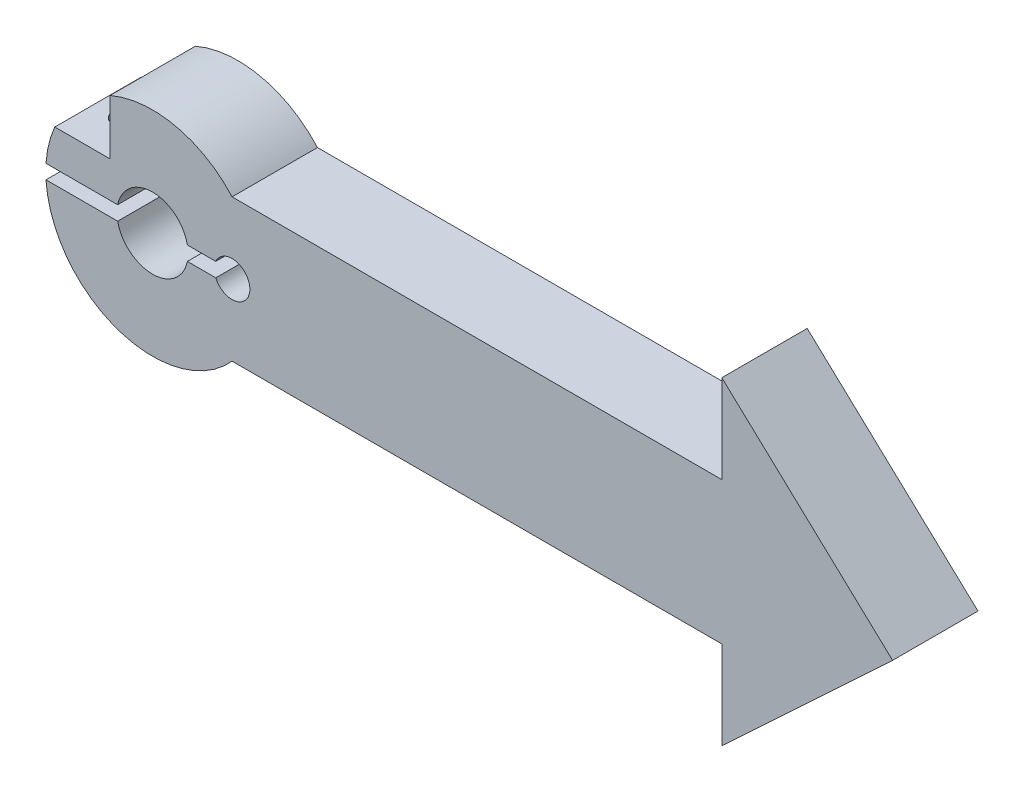
ISO-10303-21;
HEADER;
FILE_DESCRIPTION(('STEP AP214'),'2;1');
FILE_NAME('part.step','',(''),(''),'','','');
FILE_SCHEMA(('AUTOMOTIVE_DESIGN { 1 0 10303 214 1 1 1 1 }'));
ENDSEC;
DATA;
#1=APPLICATION_CONTEXT('core data for automotive mechanical design processes');
#2=APPLICATION_PROTOCOL_DEFINITION('international standard','automotive_design',2000,#1);
#3=PRODUCT_CONTEXT('',#1,'mechanical');
#4=PRODUCT('Part','Part','',(#3));
#5=PRODUCT_RELATED_PRODUCT_CATEGORY('part','',(#4));
#6=PRODUCT_DEFINITION_FORMATION('','',#4);
#7=PRODUCT_DEFINITION_CONTEXT('part definition',#1,'design');
#8=PRODUCT_DEFINITION('design','',#6,#7);
#9=PRODUCT_DEFINITION_SHAPE('','',#8);
#10=(LENGTH_UNIT() NAMED_UNIT(*) SI_UNIT(.MILLI.,.METRE.));
#11=(NAMED_UNIT(*) PLANE_ANGLE_UNIT() SI_UNIT($,.RADIAN.));
#12=(NAMED_UNIT(*) SI_UNIT($,.STERADIAN.) SOLID_ANGLE_UNIT());
#13=UNCERTAINTY_MEASURE_WITH_UNIT(LENGTH_MEASURE(1.E-05),#10,'distance_accuracy_value','');
#14=(GEOMETRIC_REPRESENTATION_CONTEXT(3) GLOBAL_UNCERTAINTY_ASSIGNED_CONTEXT((#13)) GLOBAL_UNIT_ASSIGNED_CONTEXT((#10,
#11,#12)) REPRESENTATION_CONTEXT('',''));
#15=CARTESIAN_POINT('',(0.,0.,0.));
#16=DIRECTION('',(0.,0.,1.));
#17=DIRECTION('',(1.,0.,0.));
#18=AXIS2_PLACEMENT_3D('',#15,#16,#17);
#19=CARTESIAN_POINT('',(0.,0.,15.24));
#20=DIRECTION('',(0.,0.,-1.));
#21=DIRECTION('',(-1.,0.,0.));
#22=AXIS2_PLACEMENT_3D('',#19,#20,#21);
#23=CYLINDRICAL_SURFACE('',#22,19.05);
#24=CARTESIAN_POINT('',(0.,0.,0.));
#25=DIRECTION('',(0.,0.,1.));
#26=DIRECTION('',(1.,0.,0.));
#27=AXIS2_PLACEMENT_3D('',#24,#25,#26);
#28=CIRCLE('',#27,19.05);
#29=CARTESIAN_POINT('',(14.1990316571237,12.7,0.));
#30=VERTEX_POINT('',#29);
#31=CARTESIAN_POINT('',(-7.58638208892457,17.4742469594785,0.));
#32=VERTEX_POINT('',#31);
#33=EDGE_CURVE('E206',#30,#32,#28,.T.);
#34=ORIENTED_EDGE('',*,*,#33,.T.);
#35=DIRECTION('',(0.,0.,-1.));
#36=VECTOR('',#35,1.);
#37=CARTESIAN_POINT('',(-7.58638208892456,17.4742469594785,15.24));
#38=LINE('',#37,#36);
#39=CARTESIAN_POINT('',(-7.58638208892457,17.4742469594785,15.24));
#40=VERTEX_POINT('',#39);
#41=EDGE_CURVE('E252',#32,#40,#38,.F.);
#42=ORIENTED_EDGE('',*,*,#41,.T.);
#43=CARTESIAN_POINT('',(0.,0.,15.24));
#44=DIRECTION('',(0.,0.,1.));
#45=DIRECTION('',(1.,0.,0.));
#46=AXIS2_PLACEMENT_3D('',#43,#44,#45);
#47=CIRCLE('',#46,19.05);
#48=CARTESIAN_POINT('',(14.1990316571237,12.7,15.24));
#49=VERTEX_POINT('',#48);
#50=EDGE_CURVE('E377',#49,#40,#47,.T.);
#51=ORIENTED_EDGE('',*,*,#50,.F.);
#52=DIRECTION('',(0.,0.,-1.));
#53=VECTOR('',#52,1.);
#54=CARTESIAN_POINT('',(14.1990316571237,12.7,15.24));
#55=LINE('',#54,#53);
#56=EDGE_CURVE('E227',#49,#30,#55,.T.);
#57=ORIENTED_EDGE('',*,*,#56,.T.);
#58=EDGE_LOOP('',(#34,#42,#51,#57));
#59=FACE_BOUND('',#58,.T.);
#60=ADVANCED_FACE('F32',(#59),#23,.T.);
#61=CARTESIAN_POINT('',(0.,0.,15.24));
#62=DIRECTION('',(0.,0.,-1.));
#63=DIRECTION('',(-1.,0.,0.));
#64=AXIS2_PLACEMENT_3D('',#61,#62,#63);
#65=CYLINDRICAL_SURFACE('',#64,6.35);
#66=CARTESIAN_POINT('',(0.,0.,0.));
#67=DIRECTION('',(0.,0.,-1.));
#68=DIRECTION('',(1.,0.,0.));
#69=AXIS2_PLACEMENT_3D('',#66,#67,#68);
#70=CIRCLE('',#69,6.35);
#71=CARTESIAN_POINT('',(6.22170394666927,-1.27,0.));
#72=VERTEX_POINT('',#71);
#73=CARTESIAN_POINT('',(-6.22170394666927,-1.27,0.));
#74=VERTEX_POINT('',#73);
#75=EDGE_CURVE('E185',#72,#74,#70,.T.);
#76=ORIENTED_EDGE('',*,*,#75,.T.);
#77=DIRECTION('',(0.,0.,-1.));
#78=VECTOR('',#77,1.);
#79=CARTESIAN_POINT('',(-6.22170394666927,-1.27,15.24));
#80=LINE('',#79,#78);
#81=CARTESIAN_POINT('',(-6.22170394666927,-1.27,15.24));
#82=VERTEX_POINT('',#81);
#83=EDGE_CURVE('E11',#82,#74,#80,.T.);
#84=ORIENTED_EDGE('',*,*,#83,.F.);
#85=CARTESIAN_POINT('',(0.,0.,15.24));
#86=DIRECTION('',(0.,0.,-1.));
#87=DIRECTION('',(1.,0.,0.));
#88=AXIS2_PLACEMENT_3D('',#85,#86,#87);
#89=CIRCLE('',#88,6.35);
#90=CARTESIAN_POINT('',(6.22170394666927,-1.27,15.24));
#91=VERTEX_POINT('',#90);
#92=EDGE_CURVE('E217',#91,#82,#89,.T.);
#93=ORIENTED_EDGE('',*,*,#92,.F.);
#94=DIRECTION('',(0.,0.,-1.));
#95=VECTOR('',#94,1.);
#96=CARTESIAN_POINT('',(6.22170394666927,-1.27,15.24));
#97=LINE('',#96,#95);
#98=EDGE_CURVE('E181',#91,#72,#97,.T.);
#99=ORIENTED_EDGE('',*,*,#98,.T.);
#100=EDGE_LOOP('',(#76,#84,#93,#99));
#101=FACE_BOUND('',#100,.T.);
#102=ADVANCED_FACE('F34',(#101),#65,.F.);
#103=CARTESIAN_POINT('',(-6.22170394666927,-1.27,15.24));
#104=DIRECTION('',(0.,-1.,0.));
#105=DIRECTION('',(0.,0.,-1.));
#106=AXIS2_PLACEMENT_3D('',#103,#104,#105);
#107=PLANE('',#106);
#108=CARTESIAN_POINT('',(-12.6146617357404,-1.27,7.62));
#109=DIRECTION('',(0.,-1.,0.));
#110=DIRECTION('',(0.,0.,-1.));
#111=AXIS2_PLACEMENT_3D('',#108,#109,#110);
#112=CIRCLE('',#111,2.032);
#113=CARTESIAN_POINT('',(-12.6146617357404,-1.27,5.588));
#114=VERTEX_POINT('',#113);
#115=EDGE_CURVE('E189',#114,#114,#112,.T.);
#116=ORIENTED_EDGE('',*,*,#115,.T.);
#117=EDGE_LOOP('',(#116));
#118=FACE_BOUND('',#117,.T.);
#119=DIRECTION('',(-1.,0.,0.));
#120=VECTOR('',#119,1.);
#121=CARTESIAN_POINT('',(-6.22170394666927,-1.27,0.));
#122=LINE('',#121,#120);
#123=CARTESIAN_POINT('',(-19.0076195248116,-1.27,0.));
#124=VERTEX_POINT('',#123);
#125=EDGE_CURVE('E188',#74,#124,#122,.T.);
#126=ORIENTED_EDGE('',*,*,#125,.T.);
#127=DIRECTION('',(0.,0.,-1.));
#128=VECTOR('',#127,1.);
#129=CARTESIAN_POINT('',(-19.0076195248116,-1.27,15.24));
#130=LINE('',#129,#128);
#131=CARTESIAN_POINT('',(-19.0076195248116,-1.27,15.24));
#132=VERTEX_POINT('',#131);
#133=EDGE_CURVE('E41',#132,#124,#130,.T.);
#134=ORIENTED_EDGE('',*,*,#133,.F.);
#135=DIRECTION('',(-1.,0.,0.));
#136=VECTOR('',#135,1.);
#137=CARTESIAN_POINT('',(-6.22170394666927,-1.27,15.24));
#138=LINE('',#137,#136);
#139=EDGE_CURVE('E120',#82,#132,#138,.T.);
#140=ORIENTED_EDGE('',*,*,#139,.F.);
#141=ORIENTED_EDGE('',*,*,#83,.T.);
#142=EDGE_LOOP('',(#126,#134,#140,#141));
#143=FACE_BOUND('',#142,.T.);
#144=ADVANCED_FACE('F334',(#118,#143),#107,.F.);
#145=CARTESIAN_POINT('',(0.,0.,15.24));
#146=DIRECTION('',(0.,0.,-1.));
#147=DIRECTION('',(-1.,0.,0.));
#148=AXIS2_PLACEMENT_3D('',#145,#146,#147);
#149=CYLINDRICAL_SURFACE('',#148,19.05);
#150=CARTESIAN_POINT('',(-12.6146617357404,-14.2749013759411,9.652));
#151=CARTESIAN_POINT('',(-12.4857866337776,-14.3887850958957,9.65200210380402));
#152=CARTESIAN_POINT('',(-12.3552776209016,-14.5009871859667,9.63976482709046));
#153=CARTESIAN_POINT('',(-12.094193933316,-14.7194395852111,9.58870944171503));
#154=CARTESIAN_POINT('',(-11.9636192509278,-14.8256879889063,9.54988287512061));
#155=CARTESIAN_POINT('',(-11.7307541687428,-15.010322956646,9.45318472630357));
#156=CARTESIAN_POINT('',(-11.6276828719724,-15.0902374321598,9.40013644598671));
#157=CARTESIAN_POINT('',(-11.4281486968179,-15.2419011479792,9.27381594972289));
#158=CARTESIAN_POINT('',(-11.3316764787594,-15.3136620273848,9.20057308661684));
#159=CARTESIAN_POINT('',(-11.1653640715659,-15.4352163369413,9.047943752071));
#160=CARTESIAN_POINT('',(-11.093794859303,-15.4866661642724,8.97176951989969));
#161=CARTESIAN_POINT('',(-10.9611982688009,-15.5807971715087,8.80589138700722));
#162=CARTESIAN_POINT('',(-10.9001687343882,-15.6234801452477,8.71619026062499));
#163=CARTESIAN_POINT('',(-10.7915179288074,-15.6987281148808,8.52411529702373));
#164=CARTESIAN_POINT('',(-10.7439954337551,-15.7312187451476,8.42165560553872));
#165=CARTESIAN_POINT('',(-10.666116486945,-15.7841284286655,8.20748772068497));
#166=CARTESIAN_POINT('',(-10.6357464197927,-15.8045570571779,8.09578694376513));
#167=CARTESIAN_POINT('',(-10.5970611790767,-15.8305167254227,7.88189238998532));
#168=CARTESIAN_POINT('',(-10.5864269985712,-15.8376155964626,7.78030325012898));
#169=CARTESIAN_POINT('',(-10.5805754221841,-15.8415259416978,7.57650297422804));
#170=CARTESIAN_POINT('',(-10.5853511263629,-15.8383420201222,7.4742921370121));
#171=CARTESIAN_POINT('',(-10.6092041874284,-15.8223722499117,7.2791042138714));
#172=CARTESIAN_POINT('',(-10.627339116418,-15.8102190407314,7.18595680095776));
#173=CARTESIAN_POINT('',(-10.6758526624204,-15.7775004094257,7.00447855964649));
#174=CARTESIAN_POINT('',(-10.7062315664809,-15.7569347900798,6.91614784422657));
#175=CARTESIAN_POINT('',(-10.7789351394036,-15.7072927200223,6.74353724077259));
#176=CARTESIAN_POINT('',(-10.8216148242822,-15.6779622053325,6.65948119217993));
#177=CARTESIAN_POINT('',(-10.9165605816147,-15.6119999235519,6.5001387484275));
#178=CARTESIAN_POINT('',(-10.9688299568002,-15.5753656406332,6.42485538927203));
#179=CARTESIAN_POINT('',(-11.0872312375785,-15.4913403235635,6.27612854651979));
#180=CARTESIAN_POINT('',(-11.1542584282695,-15.4432060145903,6.2038214464821));
#181=CARTESIAN_POINT('',(-11.2951900705916,-15.3404302571313,6.07165647533613));
#182=CARTESIAN_POINT('',(-11.3690980538144,-15.285785463046,6.01180504870107));
#183=CARTESIAN_POINT('',(-11.534727644024,-15.1613002437101,5.89526641352199));
#184=CARTESIAN_POINT('',(-11.6273261200758,-15.0904630563288,5.84089590568113));
#185=CARTESIAN_POINT('',(-11.8160770446297,-14.9431322680368,5.74854459211678));
#186=CARTESIAN_POINT('',(-11.9122316578885,-14.8666351924171,5.71057395402104));
#187=CARTESIAN_POINT('',(-12.1262716663098,-14.6928138564442,5.64374741298494));
#188=CARTESIAN_POINT('',(-12.2444718352153,-14.5944944234861,5.61849120540177));
#189=CARTESIAN_POINT('',(-12.4799213290006,-14.3936821795389,5.58899823514503));
#190=CARTESIAN_POINT('',(-12.5971699041568,-14.291186400879,5.58477669167939));
#191=CARTESIAN_POINT('',(-12.8525895936386,-14.0623099545596,5.59713471140405));
#192=CARTESIAN_POINT('',(-12.9900604889909,-13.9353817938513,5.6182068650858));
#193=CARTESIAN_POINT('',(-13.257701239533,-13.6810083450583,5.68747241000493));
#194=CARTESIAN_POINT('',(-13.3878641997814,-13.5535626863436,5.73569095586356));
#195=CARTESIAN_POINT('',(-13.6293047063801,-13.3105906511668,5.85467915550316));
#196=CARTESIAN_POINT('',(-13.7412665037081,-13.1948550542427,5.92363077410582));
#197=CARTESIAN_POINT('',(-13.9537034905758,-12.9699808442794,6.08578363440979));
#198=CARTESIAN_POINT('',(-14.0541993348723,-12.8608305412119,6.17894024800866));
#199=CARTESIAN_POINT('',(-14.2068292001517,-12.6915966596066,6.35415464444172));
#200=CARTESIAN_POINT('',(-14.2635429174207,-12.6277556129232,6.42859664589097));
#201=CARTESIAN_POINT('',(-14.368429663214,-12.5082772141964,6.58922534547687));
#202=CARTESIAN_POINT('',(-14.4166157465653,-12.4526273447735,6.67539372774858));
#203=CARTESIAN_POINT('',(-14.4919966887916,-12.3647523428383,6.83849227689228));
#204=CARTESIAN_POINT('',(-14.5214720627197,-12.3300804105877,6.91303211629368));
#205=CARTESIAN_POINT('',(-14.5721002999088,-12.2702050997158,7.06852577629297));
#206=CARTESIAN_POINT('',(-14.5932602650639,-12.2449936420746,7.14947405236146));
#207=CARTESIAN_POINT('',(-14.6257668489635,-12.2061506048723,7.31698780951715));
#208=CARTESIAN_POINT('',(-14.6370129788226,-12.1926376278756,7.40360146129383));
#209=CARTESIAN_POINT('',(-14.6481244629038,-12.1792873062417,7.57858256949437));
#210=CARTESIAN_POINT('',(-14.6479998111842,-12.1794379523109,7.66694841756277));
#211=CARTESIAN_POINT('',(-14.6373002197981,-12.1922918101075,7.82861913883028));
#212=CARTESIAN_POINT('',(-14.6282966177865,-12.2031075585072,7.90219384538767));
#213=CARTESIAN_POINT('',(-14.6028227009706,-12.2335792744494,8.04613235248065));
#214=CARTESIAN_POINT('',(-14.5863485174824,-12.2532398222806,8.11649446855166));
#215=CARTESIAN_POINT('',(-14.5404032105313,-12.3077541955342,8.27533032074476));
#216=CARTESIAN_POINT('',(-14.5084348595916,-12.3454831419063,8.36208776524481));
#217=CARTESIAN_POINT('',(-14.4354814724072,-12.4307092090796,8.52651649944146));
#218=CARTESIAN_POINT('',(-14.3944785373287,-12.4782257081043,8.6041692768701));
#219=CARTESIAN_POINT('',(-14.285597085439,-12.6029251837568,8.78289108522686));
#220=CARTESIAN_POINT('',(-14.2138872452639,-12.6838888681715,8.87896189508282));
#221=CARTESIAN_POINT('',(-14.0597971155596,-12.8544895649268,9.05324220528134));
#222=CARTESIAN_POINT('',(-13.9773918915456,-12.944146717052,9.13140874904422));
#223=CARTESIAN_POINT('',(-13.8313469662709,-13.0997692251502,9.24927878931659));
#224=CARTESIAN_POINT('',(-13.769823221623,-13.1644490453298,9.29338964539716));
#225=CARTESIAN_POINT('',(-13.6434629549172,-13.2953646544015,9.373912924758));
#226=CARTESIAN_POINT('',(-13.5786250361758,-13.3616010928358,9.41032206855482));
#227=CARTESIAN_POINT('',(-13.3800248309874,-13.5614331589044,9.50812232603346));
#228=CARTESIAN_POINT('',(-13.2419116611864,-13.696435021516,9.55829476417236));
#229=CARTESIAN_POINT('',(-13.0211086509943,-13.9055787614455,9.61258576714312));
#230=CARTESIAN_POINT('',(-12.9411147419666,-13.9800612847555,9.62726310361051));
#231=CARTESIAN_POINT('',(-12.779191497686,-14.1282265844785,9.64696940385761));
#232=CARTESIAN_POINT('',(-12.6972622194667,-14.2019093843654,9.65199865159968));
#233=CARTESIAN_POINT('',(-12.6146617357404,-14.2749013759411,9.652));
#234=B_SPLINE_CURVE_WITH_KNOTS('',3,(#150,#151,#152,#153,#154,#155,#156,#157,#158,#159,#160,
#161,#162,#163,#164,#165,#166,#167,#168,#169,#170,#171,#172,#173,#174,#175,#176,#177,#178,#179,
#180,#181,#182,#183,#184,#185,#186,#187,#188,#189,#190,#191,#192,#193,#194,#195,#196,#197,#198,
#199,#200,#201,#202,#203,#204,#205,#206,#207,#208,#209,#210,#211,#212,#213,#214,#215,#216,#217,
#218,#219,#220,#221,#222,#223,#224,#225,#226,#227,#228,#229,#230,#231,#232,#233),.UNSPECIFIED.,
.T.,.F.,(4,2,2,2,2,2,2,2,2,2,2,2,2,2,2,2,2,2,2,2,2,2,2,2,2,2,2,2,2,2,2,2,2,2,2,2,2,2,2,2,2,4),
(0.,0.515629978535745,1.0314240528624,1.45224229090547,1.87245206479683,2.22053710863591,
2.56855085778306,2.91904771555553,3.26926596062076,3.57481396734687,3.88022518069565,
4.16593525849906,4.45165203487627,4.74662213447884,5.04169401443996,5.36959181890863,
5.69765885579402,6.08217842520451,6.4669360488995,6.93266300254468,7.39872687467388,
7.96138734164273,8.52457004602681,9.04826872231599,9.57100859443025,9.90993515052782,
10.248338274157,10.5093914252942,10.7702211331528,11.0336652383987,11.2968777984024,
11.520583633147,11.7444054477854,12.0423303158302,12.3408508102759,12.7724820783073,
13.2051383308717,13.5034822805029,13.8019530140485,14.3975892283701,14.7280839368451,
15.0585689180565),.UNSPECIFIED.);
#235=CARTESIAN_POINT('',(-12.6146617357404,-14.2749013759411,9.652));
#236=VERTEX_POINT('',#235);
#237=EDGE_CURVE('E251',#236,#236,#234,.T.);
#238=ORIENTED_EDGE('',*,*,#237,.T.);
#239=EDGE_LOOP('',(#238));
#240=FACE_BOUND('',#239,.T.);
#241=CARTESIAN_POINT('',(0.,0.,0.));
#242=DIRECTION('',(0.,0.,1.));
#243=DIRECTION('',(1.,0.,0.));
#244=AXIS2_PLACEMENT_3D('',#241,#242,#243);
#245=CIRCLE('',#244,19.05);
#246=CARTESIAN_POINT('',(14.1990316571237,-12.7,0.));
#247=VERTEX_POINT('',#246);
#248=EDGE_CURVE('E191',#124,#247,#245,.T.);
#249=ORIENTED_EDGE('',*,*,#248,.T.);
#250=DIRECTION('',(0.,0.,-1.));
#251=VECTOR('',#250,1.);
#252=CARTESIAN_POINT('',(14.1990316571237,-12.7,15.24));
#253=LINE('',#252,#251);
#254=CARTESIAN_POINT('',(14.1990316571237,-12.7,15.24));
#255=VERTEX_POINT('',#254);
#256=EDGE_CURVE('E245',#255,#247,#253,.T.);
#257=ORIENTED_EDGE('',*,*,#256,.F.);
#258=CARTESIAN_POINT('',(0.,0.,15.24));
#259=DIRECTION('',(0.,0.,1.));
#260=DIRECTION('',(1.,0.,0.));
#261=AXIS2_PLACEMENT_3D('',#258,#259,#260);
#262=CIRCLE('',#261,19.05);
#263=EDGE_CURVE('E392',#132,#255,#262,.T.);
#264=ORIENTED_EDGE('',*,*,#263,.F.);
#265=ORIENTED_EDGE('',*,*,#133,.T.);
#266=EDGE_LOOP('',(#249,#257,#264,#265));
#267=FACE_BOUND('',#266,.T.);
#268=ADVANCED_FACE('F273',(#240,#267),#149,.T.);
#269=CARTESIAN_POINT('',(14.1990316571237,-12.7,15.24));
#270=DIRECTION('',(0.,1.,0.));
#271=DIRECTION('',(0.,0.,1.));
#272=AXIS2_PLACEMENT_3D('',#269,#270,#271);
#273=PLANE('',#272);
#274=DIRECTION('',(1.,0.,0.));
#275=VECTOR('',#274,1.);
#276=CARTESIAN_POINT('',(14.1990316571237,-12.7,0.));
#277=LINE('',#276,#275);
#278=CARTESIAN_POINT('',(101.6,-12.7,0.));
#279=VERTEX_POINT('',#278);
#280=EDGE_CURVE('E193',#247,#279,#277,.T.);
#281=ORIENTED_EDGE('',*,*,#280,.T.);
#282=DIRECTION('',(0.,0.,-1.));
#283=VECTOR('',#282,1.);
#284=CARTESIAN_POINT('',(101.6,-12.7,15.24));
#285=LINE('',#284,#283);
#286=CARTESIAN_POINT('',(101.6,-12.7,15.24));
#287=VERTEX_POINT('',#286);
#288=EDGE_CURVE('E242',#287,#279,#285,.T.);
#289=ORIENTED_EDGE('',*,*,#288,.F.);
#290=DIRECTION('',(1.,0.,0.));
#291=VECTOR('',#290,1.);
#292=CARTESIAN_POINT('',(14.1990316571237,-12.7,15.24));
#293=LINE('',#292,#291);
#294=EDGE_CURVE('E396',#255,#287,#293,.T.);
#295=ORIENTED_EDGE('',*,*,#294,.F.);
#296=ORIENTED_EDGE('',*,*,#256,.T.);
#297=EDGE_LOOP('',(#281,#289,#295,#296));
#298=FACE_BOUND('',#297,.T.);
#299=ADVANCED_FACE('F327',(#298),#273,.F.);
#300=CARTESIAN_POINT('',(101.6,-12.7,15.24));
#301=DIRECTION('',(1.,0.,0.));
#302=DIRECTION('',(0.,0.,-1.));
#303=AXIS2_PLACEMENT_3D('',#300,#301,#302);
#304=PLANE('',#303);
#305=DIRECTION('',(0.,-1.,0.));
#306=VECTOR('',#305,1.);
#307=CARTESIAN_POINT('',(101.6,-12.7,0.));
#308=LINE('',#307,#306);
#309=CARTESIAN_POINT('',(101.6,-28.448,0.));
#310=VERTEX_POINT('',#309);
#311=EDGE_CURVE('E195',#279,#310,#308,.T.);
#312=ORIENTED_EDGE('',*,*,#311,.T.);
#313=DIRECTION('',(0.,0.,-1.));
#314=VECTOR('',#313,1.);
#315=CARTESIAN_POINT('',(101.6,-28.448,15.24));
#316=LINE('',#315,#314);
#317=CARTESIAN_POINT('',(101.6,-28.448,15.24));
#318=VERTEX_POINT('',#317);
#319=EDGE_CURVE('E239',#318,#310,#316,.T.);
#320=ORIENTED_EDGE('',*,*,#319,.F.);
#321=DIRECTION('',(0.,-1.,0.));
#322=VECTOR('',#321,1.);
#323=CARTESIAN_POINT('',(101.6,-12.7,15.24));
#324=LINE('',#323,#322);
#325=EDGE_CURVE('E398',#287,#318,#324,.T.);
#326=ORIENTED_EDGE('',*,*,#325,.F.);
#327=ORIENTED_EDGE('',*,*,#288,.T.);
#328=EDGE_LOOP('',(#312,#320,#326,#327));
#329=FACE_BOUND('',#328,.T.);
#330=ADVANCED_FACE('F324',(#329),#304,.F.);
#331=CARTESIAN_POINT('',(101.6,-28.448,15.24));
#332=DIRECTION('',(-0.682318250360011,0.731055268242869,0.));
#333=DIRECTION('',(-0.731055268242869,-0.682318250360011,0.));
#334=AXIS2_PLACEMENT_3D('',#331,#332,#333);
#335=PLANE('',#334);
#336=DIRECTION('',(0.731055268242869,0.682318250360011,0.));
#337=VECTOR('',#336,1.);
#338=CARTESIAN_POINT('',(101.6,-28.448,0.));
#339=LINE('',#338,#337);
#340=CARTESIAN_POINT('',(132.08,0.,0.));
#341=VERTEX_POINT('',#340);
#342=EDGE_CURVE('E197',#310,#341,#339,.T.);
#343=ORIENTED_EDGE('',*,*,#342,.T.);
#344=DIRECTION('',(0.,0.,-1.));
#345=VECTOR('',#344,1.);
#346=CARTESIAN_POINT('',(132.08,0.,15.24));
#347=LINE('',#346,#345);
#348=CARTESIAN_POINT('',(132.08,0.,15.24));
#349=VERTEX_POINT('',#348);
#350=EDGE_CURVE('E236',#349,#341,#347,.T.);
#351=ORIENTED_EDGE('',*,*,#350,.F.);
#352=DIRECTION('',(0.731055268242869,0.682318250360011,0.));
#353=VECTOR('',#352,1.);
#354=CARTESIAN_POINT('',(101.6,-28.448,15.24));
#355=LINE('',#354,#353);
#356=EDGE_CURVE('E400',#318,#349,#355,.T.);
#357=ORIENTED_EDGE('',*,*,#356,.F.);
#358=ORIENTED_EDGE('',*,*,#319,.T.);
#359=EDGE_LOOP('',(#343,#351,#357,#358));
#360=FACE_BOUND('',#359,.T.);
#361=ADVANCED_FACE('F320',(#360),#335,.F.);
#362=CARTESIAN_POINT('',(101.6,28.448,15.24));
#363=DIRECTION('',(-0.682318250360011,-0.731055268242869,0.));
#364=DIRECTION('',(0.731055268242869,-0.682318250360011,0.));
#365=AXIS2_PLACEMENT_3D('',#362,#363,#364);
#366=PLANE('',#365);
#367=DIRECTION('',(-0.731055268242869,0.682318250360011,0.));
#368=VECTOR('',#367,1.);
#369=CARTESIAN_POINT('',(101.6,28.448,0.));
#370=LINE('',#369,#368);
#371=CARTESIAN_POINT('',(101.6,28.448,0.));
#372=VERTEX_POINT('',#371);
#373=EDGE_CURVE('E199',#341,#372,#370,.T.);
#374=ORIENTED_EDGE('',*,*,#373,.T.);
#375=DIRECTION('',(0.,0.,-1.));
#376=VECTOR('',#375,1.);
#377=CARTESIAN_POINT('',(101.6,28.448,15.24));
#378=LINE('',#377,#376);
#379=CARTESIAN_POINT('',(101.6,28.448,15.24));
#380=VERTEX_POINT('',#379);
#381=EDGE_CURVE('E233',#380,#372,#378,.T.);
#382=ORIENTED_EDGE('',*,*,#381,.F.);
#383=DIRECTION('',(-0.731055268242869,0.682318250360011,0.));
#384=VECTOR('',#383,1.);
#385=CARTESIAN_POINT('',(101.6,28.448,15.24));
#386=LINE('',#385,#384);
#387=EDGE_CURVE('E402',#349,#380,#386,.T.);
#388=ORIENTED_EDGE('',*,*,#387,.F.);
#389=ORIENTED_EDGE('',*,*,#350,.T.);
#390=EDGE_LOOP('',(#374,#382,#388,#389));
#391=FACE_BOUND('',#390,.T.);
#392=ADVANCED_FACE('F316',(#391),#366,.F.);
#393=CARTESIAN_POINT('',(101.6,12.7,15.24));
#394=DIRECTION('',(1.,0.,0.));
#395=DIRECTION('',(0.,0.,-1.));
#396=AXIS2_PLACEMENT_3D('',#393,#394,#395);
#397=PLANE('',#396);
#398=DIRECTION('',(0.,-1.,0.));
#399=VECTOR('',#398,1.);
#400=CARTESIAN_POINT('',(101.6,12.7,0.));
#401=LINE('',#400,#399);
#402=CARTESIAN_POINT('',(101.6,12.7,0.));
#403=VERTEX_POINT('',#402);
#404=EDGE_CURVE('E201',#372,#403,#401,.T.);
#405=ORIENTED_EDGE('',*,*,#404,.T.);
#406=DIRECTION('',(0.,0.,-1.));
#407=VECTOR('',#406,1.);
#408=CARTESIAN_POINT('',(101.6,12.7,15.24));
#409=LINE('',#408,#407);
#410=CARTESIAN_POINT('',(101.6,12.7,15.24));
#411=VERTEX_POINT('',#410);
#412=EDGE_CURVE('E230',#411,#403,#409,.T.);
#413=ORIENTED_EDGE('',*,*,#412,.F.);
#414=DIRECTION('',(0.,-1.,0.));
#415=VECTOR('',#414,1.);
#416=CARTESIAN_POINT('',(101.6,12.7,15.24));
#417=LINE('',#416,#415);
#418=EDGE_CURVE('E381',#380,#411,#417,.T.);
#419=ORIENTED_EDGE('',*,*,#418,.F.);
#420=ORIENTED_EDGE('',*,*,#381,.T.);
#421=EDGE_LOOP('',(#405,#413,#419,#420));
#422=FACE_BOUND('',#421,.T.);
#423=ADVANCED_FACE('F312',(#422),#397,.F.);
#424=CARTESIAN_POINT('',(14.1990316571237,12.7,15.24));
#425=DIRECTION('',(0.,-1.,0.));
#426=DIRECTION('',(0.,0.,-1.));
#427=AXIS2_PLACEMENT_3D('',#424,#425,#426);
#428=PLANE('',#427);
#429=DIRECTION('',(-1.,0.,0.));
#430=VECTOR('',#429,1.);
#431=CARTESIAN_POINT('',(14.1990316571237,12.7,0.));
#432=LINE('',#431,#430);
#433=EDGE_CURVE('E203',#403,#30,#432,.T.);
#434=ORIENTED_EDGE('',*,*,#433,.T.);
#435=ORIENTED_EDGE('',*,*,#56,.F.);
#436=DIRECTION('',(-1.,0.,0.));
#437=VECTOR('',#436,1.);
#438=CARTESIAN_POINT('',(14.1990316571237,12.7,15.24));
#439=LINE('',#438,#437);
#440=EDGE_CURVE('E378',#411,#49,#439,.T.);
#441=ORIENTED_EDGE('',*,*,#440,.F.);
#442=ORIENTED_EDGE('',*,*,#412,.T.);
#443=EDGE_LOOP('',(#434,#435,#441,#442));
#444=FACE_BOUND('',#443,.T.);
#445=ADVANCED_FACE('F308',(#444),#428,.F.);
#446=CARTESIAN_POINT('',(-17.4338537044698,7.6787528291477,15.24));
#447=VERTEX_POINT('',#446);
#448=CARTESIAN_POINT('',(-19.0076195248116,1.27,15.24));
#449=VERTEX_POINT('',#448);
#450=EDGE_CURVE('E372',#447,#449,#47,.T.);
#451=ORIENTED_EDGE('',*,*,#450,.F.);
#452=DIRECTION('',(0.,0.,-1.));
#453=VECTOR('',#452,1.);
#454=CARTESIAN_POINT('',(-17.4338537044698,7.6787528291477,15.24));
#455=LINE('',#454,#453);
#456=CARTESIAN_POINT('',(-17.4338537044698,7.6787528291477,0.));
#457=VERTEX_POINT('',#456);
#458=EDGE_CURVE('E258',#447,#457,#455,.T.);
#459=ORIENTED_EDGE('',*,*,#458,.T.);
#460=CARTESIAN_POINT('',(-19.0076195248116,1.27,0.));
#461=VERTEX_POINT('',#460);
#462=EDGE_CURVE('E205',#457,#461,#28,.T.);
#463=ORIENTED_EDGE('',*,*,#462,.T.);
#464=DIRECTION('',(0.,0.,-1.));
#465=VECTOR('',#464,1.);
#466=CARTESIAN_POINT('',(-19.0076195248116,1.27,15.24));
#467=LINE('',#466,#465);
#468=EDGE_CURVE('E224',#449,#461,#467,.T.);
#469=ORIENTED_EDGE('',*,*,#468,.F.);
#470=EDGE_LOOP('',(#451,#459,#463,#469));
#471=FACE_BOUND('',#470,.T.);
#472=ADVANCED_FACE('F305',(#471),#23,.T.);
#473=CARTESIAN_POINT('',(-19.0076195248116,1.27,15.24));
#474=DIRECTION('',(0.,1.,0.));
#475=DIRECTION('',(0.,0.,1.));
#476=AXIS2_PLACEMENT_3D('',#473,#474,#475);
#477=PLANE('',#476);
#478=CARTESIAN_POINT('',(-12.6146617357404,1.27,7.62));
#479=DIRECTION('',(0.,1.,0.));
#480=DIRECTION('',(0.,0.,1.));
#481=AXIS2_PLACEMENT_3D('',#478,#479,#480);
#482=CIRCLE('',#481,2.032);
#483=CARTESIAN_POINT('',(-12.6146617357404,1.27,9.652));
#484=VERTEX_POINT('',#483);
#485=EDGE_CURVE('E249',#484,#484,#482,.T.);
#486=ORIENTED_EDGE('',*,*,#485,.T.);
#487=EDGE_LOOP('',(#486));
#488=FACE_BOUND('',#487,.T.);
#489=DIRECTION('',(1.,0.,0.));
#490=VECTOR('',#489,1.);
#491=CARTESIAN_POINT('',(-19.0076195248116,1.27,0.));
#492=LINE('',#491,#490);
#493=CARTESIAN_POINT('',(-6.22170394666927,1.27,0.));
#494=VERTEX_POINT('',#493);
#495=EDGE_CURVE('E209',#461,#494,#492,.T.);
#496=ORIENTED_EDGE('',*,*,#495,.T.);
#497=DIRECTION('',(0.,0.,-1.));
#498=VECTOR('',#497,1.);
#499=CARTESIAN_POINT('',(-6.22170394666927,1.27,15.24));
#500=LINE('',#499,#498);
#501=CARTESIAN_POINT('',(-6.22170394666927,1.27,15.24));
#502=VERTEX_POINT('',#501);
#503=EDGE_CURVE('E221',#502,#494,#500,.T.);
#504=ORIENTED_EDGE('',*,*,#503,.F.);
#505=DIRECTION('',(1.,0.,0.));
#506=VECTOR('',#505,1.);
#507=CARTESIAN_POINT('',(-19.0076195248116,1.27,15.24));
#508=LINE('',#507,#506);
#509=EDGE_CURVE('E380',#449,#502,#508,.T.);
#510=ORIENTED_EDGE('',*,*,#509,.F.);
#511=ORIENTED_EDGE('',*,*,#468,.T.);
#512=EDGE_LOOP('',(#496,#504,#510,#511));
#513=FACE_BOUND('',#512,.T.);
#514=ADVANCED_FACE('F301',(#488,#513),#477,.F.);
#515=CARTESIAN_POINT('',(0.,0.,15.24));
#516=DIRECTION('',(0.,0.,-1.));
#517=DIRECTION('',(-1.,0.,0.));
#518=AXIS2_PLACEMENT_3D('',#515,#516,#517);
#519=CYLINDRICAL_SURFACE('',#518,6.35);
#520=CARTESIAN_POINT('',(0.,0.,0.));
#521=DIRECTION('',(0.,0.,-1.));
#522=DIRECTION('',(1.,0.,0.));
#523=AXIS2_PLACEMENT_3D('',#520,#521,#522);
#524=CIRCLE('',#523,6.35);
#525=CARTESIAN_POINT('',(6.22170394666927,1.27,0.));
#526=VERTEX_POINT('',#525);
#527=EDGE_CURVE('E211',#494,#526,#524,.T.);
#528=ORIENTED_EDGE('',*,*,#527,.T.);
#529=DIRECTION('',(0.,0.,-1.));
#530=VECTOR('',#529,1.);
#531=CARTESIAN_POINT('',(6.22170394666927,1.27,15.24));
#532=LINE('',#531,#530);
#533=CARTESIAN_POINT('',(6.22170394666927,1.27,15.24));
#534=VERTEX_POINT('',#533);
#535=EDGE_CURVE('E176',#534,#526,#532,.T.);
#536=ORIENTED_EDGE('',*,*,#535,.F.);
#537=CARTESIAN_POINT('',(0.,0.,15.24));
#538=DIRECTION('',(0.,0.,-1.));
#539=DIRECTION('',(1.,0.,0.));
#540=AXIS2_PLACEMENT_3D('',#537,#538,#539);
#541=CIRCLE('',#540,6.35);
#542=EDGE_CURVE('E164',#502,#534,#541,.T.);
#543=ORIENTED_EDGE('',*,*,#542,.F.);
#544=ORIENTED_EDGE('',*,*,#503,.T.);
#545=EDGE_LOOP('',(#528,#536,#543,#544));
#546=FACE_BOUND('',#545,.T.);
#547=ADVANCED_FACE('F298',(#546),#519,.F.);
#548=CARTESIAN_POINT('',(11.2890960908267,1.27,15.24));
#549=DIRECTION('',(0.,1.,0.));
#550=DIRECTION('',(-1.,0.,0.));
#551=AXIS2_PLACEMENT_3D('',#548,#549,#550);
#552=PLANE('',#551);
#553=DIRECTION('',(1.,0.,0.));
#554=VECTOR('',#553,1.);
#555=CARTESIAN_POINT('',(11.2890960908267,1.27,0.));
#556=LINE('',#555,#554);
#557=CARTESIAN_POINT('',(11.2890960908267,1.27,0.));
#558=VERTEX_POINT('',#557);
#559=EDGE_CURVE('E173',#526,#558,#556,.T.);
#560=ORIENTED_EDGE('',*,*,#559,.T.);
#561=DIRECTION('',(0.,0.,-1.));
#562=VECTOR('',#561,1.);
#563=CARTESIAN_POINT('',(11.2890960908267,1.27,15.24));
#564=LINE('',#563,#562);
#565=CARTESIAN_POINT('',(11.2890960908267,1.27,15.24));
#566=VERTEX_POINT('',#565);
#567=EDGE_CURVE('E170',#566,#558,#564,.T.);
#568=ORIENTED_EDGE('',*,*,#567,.F.);
#569=DIRECTION('',(1.,0.,0.));
#570=VECTOR('',#569,1.);
#571=CARTESIAN_POINT('',(11.2890960908267,1.27,15.24));
#572=LINE('',#571,#570);
#573=EDGE_CURVE('E156',#534,#566,#572,.T.);
#574=ORIENTED_EDGE('',*,*,#573,.F.);
#575=ORIENTED_EDGE('',*,*,#535,.T.);
#576=EDGE_LOOP('',(#560,#568,#574,#575));
#577=FACE_BOUND('',#576,.T.);
#578=ADVANCED_FACE('F171',(#577),#552,.F.);
#579=CARTESIAN_POINT('',(14.1990316571237,0.,15.24));
#580=DIRECTION('',(0.,0.,-1.));
#581=DIRECTION('',(-1.,0.,0.));
#582=AXIS2_PLACEMENT_3D('',#579,#580,#581);
#583=CYLINDRICAL_SURFACE('',#582,3.175);
#584=CARTESIAN_POINT('',(14.1990316571237,0.,0.));
#585=DIRECTION('',(0.,0.,-1.));
#586=DIRECTION('',(1.,0.,0.));
#587=AXIS2_PLACEMENT_3D('',#584,#585,#586);
#588=CIRCLE('',#587,3.175);
#589=CARTESIAN_POINT('',(11.2890960908267,-1.27,0.));
#590=VERTEX_POINT('',#589);
#591=EDGE_CURVE('E214',#558,#590,#588,.T.);
#592=ORIENTED_EDGE('',*,*,#591,.T.);
#593=DIRECTION('',(0.,0.,-1.));
#594=VECTOR('',#593,1.);
#595=CARTESIAN_POINT('',(11.2890960908267,-1.27,15.24));
#596=LINE('',#595,#594);
#597=CARTESIAN_POINT('',(11.2890960908267,-1.27,15.24));
#598=VERTEX_POINT('',#597);
#599=EDGE_CURVE('E177',#598,#590,#596,.T.);
#600=ORIENTED_EDGE('',*,*,#599,.F.);
#601=CARTESIAN_POINT('',(14.1990316571237,0.,15.24));
#602=DIRECTION('',(0.,0.,-1.));
#603=DIRECTION('',(1.,0.,0.));
#604=AXIS2_PLACEMENT_3D('',#601,#602,#603);
#605=CIRCLE('',#604,3.175);
#606=EDGE_CURVE('E161',#566,#598,#605,.T.);
#607=ORIENTED_EDGE('',*,*,#606,.F.);
#608=ORIENTED_EDGE('',*,*,#567,.T.);
#609=EDGE_LOOP('',(#592,#600,#607,#608));
#610=FACE_BOUND('',#609,.T.);
#611=ADVANCED_FACE('F179',(#610),#583,.F.);
#612=CARTESIAN_POINT('',(11.2890960908267,-1.27,15.24));
#613=DIRECTION('',(0.,-1.,0.));
#614=DIRECTION('',(0.,0.,-1.));
#615=AXIS2_PLACEMENT_3D('',#612,#613,#614);
#616=PLANE('',#615);
#617=DIRECTION('',(-1.,0.,0.));
#618=VECTOR('',#617,1.);
#619=CARTESIAN_POINT('',(11.2890960908267,-1.27,0.));
#620=LINE('',#619,#618);
#621=EDGE_CURVE('E112',#590,#72,#620,.T.);
#622=ORIENTED_EDGE('',*,*,#621,.T.);
#623=ORIENTED_EDGE('',*,*,#98,.F.);
#624=DIRECTION('',(-1.,0.,0.));
#625=VECTOR('',#624,1.);
#626=CARTESIAN_POINT('',(11.2890960908267,-1.27,15.24));
#627=LINE('',#626,#625);
#628=EDGE_CURVE('E58',#598,#91,#627,.T.);
#629=ORIENTED_EDGE('',*,*,#628,.F.);
#630=ORIENTED_EDGE('',*,*,#599,.T.);
#631=EDGE_LOOP('',(#622,#623,#629,#630));
#632=FACE_BOUND('',#631,.T.);
#633=ADVANCED_FACE('F288',(#632),#616,.F.);
#634=CARTESIAN_POINT('',(0.,0.,15.24));
#635=DIRECTION('',(0.,0.,1.));
#636=DIRECTION('',(1.,0.,0.));
#637=AXIS2_PLACEMENT_3D('',#634,#635,#636);
#638=PLANE('',#637);
#639=DIRECTION('',(0.,1.,0.));
#640=VECTOR('',#639,1.);
#641=CARTESIAN_POINT('',(-7.58638208892457,7.6787528291477,15.24));
#642=LINE('',#641,#640);
#643=CARTESIAN_POINT('',(-7.58638208892457,7.6787528291477,15.24));
#644=VERTEX_POINT('',#643);
#645=EDGE_CURVE('E354',#644,#40,#642,.T.);
#646=ORIENTED_EDGE('',*,*,#645,.F.);
#647=DIRECTION('',(1.,0.,0.));
#648=VECTOR('',#647,1.);
#649=CARTESIAN_POINT('',(-7.58638208892457,7.6787528291477,15.24));
#650=LINE('',#649,#648);
#651=EDGE_CURVE('E349',#447,#644,#650,.T.);
#652=ORIENTED_EDGE('',*,*,#651,.F.);
#653=ORIENTED_EDGE('',*,*,#450,.T.);
#654=ORIENTED_EDGE('',*,*,#509,.T.);
#655=ORIENTED_EDGE('',*,*,#542,.T.);
#656=ORIENTED_EDGE('',*,*,#573,.T.);
#657=ORIENTED_EDGE('',*,*,#606,.T.);
#658=ORIENTED_EDGE('',*,*,#628,.T.);
#659=ORIENTED_EDGE('',*,*,#92,.T.);
#660=ORIENTED_EDGE('',*,*,#139,.T.);
#661=ORIENTED_EDGE('',*,*,#263,.T.);
#662=ORIENTED_EDGE('',*,*,#294,.T.);
#663=ORIENTED_EDGE('',*,*,#325,.T.);
#664=ORIENTED_EDGE('',*,*,#356,.T.);
#665=ORIENTED_EDGE('',*,*,#387,.T.);
#666=ORIENTED_EDGE('',*,*,#418,.T.);
#667=ORIENTED_EDGE('',*,*,#440,.T.);
#668=ORIENTED_EDGE('',*,*,#50,.T.);
#669=EDGE_LOOP('',(#646,#652,#653,#654,#655,#656,#657,#658,#659,#660,#661,#662,#663,#664,#665,
#666,#667,#668));
#670=FACE_BOUND('',#669,.T.);
#671=ADVANCED_FACE('F159',(#670),#638,.T.);
#672=CARTESIAN_POINT('',(0.,0.,0.));
#673=DIRECTION('',(0.,0.,1.));
#674=DIRECTION('',(1.,0.,0.));
#675=AXIS2_PLACEMENT_3D('',#672,#673,#674);
#676=PLANE('',#675);
#677=DIRECTION('',(1.,0.,0.));
#678=VECTOR('',#677,1.);
#679=CARTESIAN_POINT('',(-7.58638208892457,7.6787528291477,0.));
#680=LINE('',#679,#678);
#681=CARTESIAN_POINT('',(-7.58638208892457,7.6787528291477,0.));
#682=VERTEX_POINT('',#681);
#683=EDGE_CURVE('E348',#457,#682,#680,.T.);
#684=ORIENTED_EDGE('',*,*,#683,.T.);
#685=DIRECTION('',(0.,1.,0.));
#686=VECTOR('',#685,1.);
#687=CARTESIAN_POINT('',(-7.58638208892457,7.6787528291477,0.));
#688=LINE('',#687,#686);
#689=EDGE_CURVE('E49',#682,#32,#688,.T.);
#690=ORIENTED_EDGE('',*,*,#689,.T.);
#691=ORIENTED_EDGE('',*,*,#33,.F.);
#692=ORIENTED_EDGE('',*,*,#433,.F.);
#693=ORIENTED_EDGE('',*,*,#404,.F.);
#694=ORIENTED_EDGE('',*,*,#373,.F.);
#695=ORIENTED_EDGE('',*,*,#342,.F.);
#696=ORIENTED_EDGE('',*,*,#311,.F.);
#697=ORIENTED_EDGE('',*,*,#280,.F.);
#698=ORIENTED_EDGE('',*,*,#248,.F.);
#699=ORIENTED_EDGE('',*,*,#125,.F.);
#700=ORIENTED_EDGE('',*,*,#75,.F.);
#701=ORIENTED_EDGE('',*,*,#621,.F.);
#702=ORIENTED_EDGE('',*,*,#591,.F.);
#703=ORIENTED_EDGE('',*,*,#559,.F.);
#704=ORIENTED_EDGE('',*,*,#527,.F.);
#705=ORIENTED_EDGE('',*,*,#495,.F.);
#706=ORIENTED_EDGE('',*,*,#462,.F.);
#707=EDGE_LOOP('',(#684,#690,#691,#692,#693,#694,#695,#696,#697,#698,#699,#700,#701,#702,#703,
#704,#705,#706));
#708=FACE_BOUND('',#707,.T.);
#709=ADVANCED_FACE('F287',(#708),#676,.F.);
#710=CARTESIAN_POINT('',(-12.6146617357404,-28.448,7.62));
#711=DIRECTION('',(0.,1.,0.));
#712=DIRECTION('',(0.,0.,1.));
#713=AXIS2_PLACEMENT_3D('',#710,#711,#712);
#714=CYLINDRICAL_SURFACE('',#713,2.032);
#715=CARTESIAN_POINT('',(-12.6146617357404,7.6787528291477,7.62));
#716=DIRECTION('',(0.,-1.,0.));
#717=DIRECTION('',(0.,0.,-1.));
#718=AXIS2_PLACEMENT_3D('',#715,#716,#717);
#719=CIRCLE('',#718,2.032);
#720=CARTESIAN_POINT('',(-12.6146617357404,7.6787528291477,5.588));
#721=VERTEX_POINT('',#720);
#722=EDGE_CURVE('E36',#721,#721,#719,.F.);
#723=ORIENTED_EDGE('',*,*,#722,.T.);
#724=EDGE_LOOP('',(#723));
#725=FACE_BOUND('',#724,.T.);
#726=ORIENTED_EDGE('',*,*,#485,.F.);
#727=EDGE_LOOP('',(#726));
#728=FACE_BOUND('',#727,.T.);
#729=ADVANCED_FACE('F282',(#725,#728),#714,.F.);
#730=ORIENTED_EDGE('',*,*,#237,.F.);
#731=EDGE_LOOP('',(#730));
#732=FACE_BOUND('',#731,.T.);
#733=ORIENTED_EDGE('',*,*,#115,.F.);
#734=EDGE_LOOP('',(#733));
#735=FACE_BOUND('',#734,.T.);
#736=ADVANCED_FACE('F276',(#732,#735),#714,.F.);
#737=CARTESIAN_POINT('',(-7.58638208892457,7.6787528291477,0.));
#738=DIRECTION('',(1.,0.,0.));
#739=DIRECTION('',(0.,0.,-1.));
#740=AXIS2_PLACEMENT_3D('',#737,#738,#739);
#741=PLANE('',#740);
#742=ORIENTED_EDGE('',*,*,#689,.F.);
#743=DIRECTION('',(0.,0.,1.));
#744=VECTOR('',#743,1.);
#745=CARTESIAN_POINT('',(-7.58638208892457,7.6787528291477,0.));
#746=LINE('',#745,#744);
#747=EDGE_CURVE('E351',#682,#644,#746,.T.);
#748=ORIENTED_EDGE('',*,*,#747,.T.);
#749=ORIENTED_EDGE('',*,*,#645,.T.);
#750=ORIENTED_EDGE('',*,*,#41,.F.);
#751=EDGE_LOOP('',(#742,#748,#749,#750));
#752=FACE_BOUND('',#751,.T.);
#753=ADVANCED_FACE('F281',(#752),#741,.F.);
#754=CARTESIAN_POINT('',(-7.58638208892457,7.6787528291477,0.));
#755=DIRECTION('',(0.,-1.,0.));
#756=DIRECTION('',(0.,0.,-1.));
#757=AXIS2_PLACEMENT_3D('',#754,#755,#756);
#758=PLANE('',#757);
#759=ORIENTED_EDGE('',*,*,#722,.F.);
#760=EDGE_LOOP('',(#759));
#761=FACE_BOUND('',#760,.T.);
#762=ORIENTED_EDGE('',*,*,#651,.T.);
#763=ORIENTED_EDGE('',*,*,#747,.F.);
#764=ORIENTED_EDGE('',*,*,#683,.F.);
#765=ORIENTED_EDGE('',*,*,#458,.F.);
#766=EDGE_LOOP('',(#762,#763,#764,#765));
#767=FACE_BOUND('',#766,.T.);
#768=ADVANCED_FACE('F364',(#761,#767),#758,.F.);
#769=CLOSED_SHELL('',(#60,#102,#144,#268,#299,#330,#361,#392,#423,#445,#472,#514,#547,#578,#611,
#633,#671,#709,#729,#736,#753,#768));
#770=MANIFOLD_SOLID_BREP('B2',#769);
#771=ADVANCED_BREP_SHAPE_REPRESENTATION('',(#18,#770),#14);
#772=SHAPE_DEFINITION_REPRESENTATION(#9,#771);
ENDSEC;
END-ISO-10303-21;
